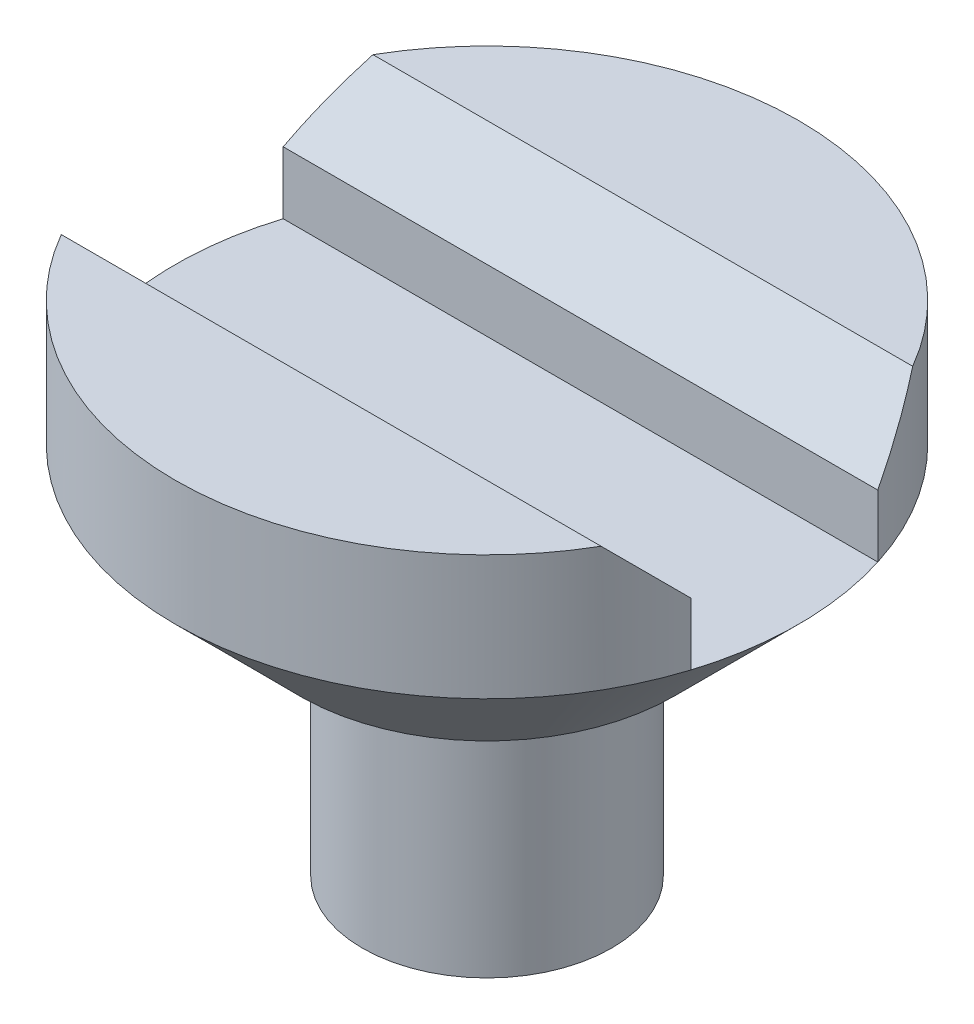
ISO-10303-21;
HEADER;
FILE_DESCRIPTION(('STEP AP214'),'2;1');
FILE_NAME('part.step','',(''),(''),'','','');
FILE_SCHEMA(('AUTOMOTIVE_DESIGN { 1 0 10303 214 1 1 1 1 }'));
ENDSEC;
DATA;
#1=APPLICATION_CONTEXT('core data for automotive mechanical design processes');
#2=APPLICATION_PROTOCOL_DEFINITION('international standard','automotive_design',2000,#1);
#3=PRODUCT_CONTEXT('',#1,'mechanical');
#4=PRODUCT('Part','Part','',(#3));
#5=PRODUCT_RELATED_PRODUCT_CATEGORY('part','',(#4));
#6=PRODUCT_DEFINITION_FORMATION('','',#4);
#7=PRODUCT_DEFINITION_CONTEXT('part definition',#1,'design');
#8=PRODUCT_DEFINITION('design','',#6,#7);
#9=PRODUCT_DEFINITION_SHAPE('','',#8);
#10=(LENGTH_UNIT() NAMED_UNIT(*) SI_UNIT(.MILLI.,.METRE.));
#11=(NAMED_UNIT(*) PLANE_ANGLE_UNIT() SI_UNIT($,.RADIAN.));
#12=(NAMED_UNIT(*) SI_UNIT($,.STERADIAN.) SOLID_ANGLE_UNIT());
#13=UNCERTAINTY_MEASURE_WITH_UNIT(LENGTH_MEASURE(1.E-05),#10,'distance_accuracy_value','');
#14=(GEOMETRIC_REPRESENTATION_CONTEXT(3) GLOBAL_UNCERTAINTY_ASSIGNED_CONTEXT((#13)) GLOBAL_UNIT_ASSIGNED_CONTEXT((#10,
#11,#12)) REPRESENTATION_CONTEXT('',''));
#15=CARTESIAN_POINT('',(0.,0.,0.));
#16=DIRECTION('',(0.,0.,1.));
#17=DIRECTION('',(1.,0.,0.));
#18=AXIS2_PLACEMENT_3D('',#15,#16,#17);
#19=CARTESIAN_POINT('',(0.,0.,0.));
#20=DIRECTION('',(0.,-1.,0.));
#21=DIRECTION('',(0.,0.,-1.));
#22=AXIS2_PLACEMENT_3D('',#19,#20,#21);
#23=CYLINDRICAL_SURFACE('',#22,63.5);
#24=DIRECTION('',(0.,-1.,0.));
#25=VECTOR('',#24,1.);
#26=CARTESIAN_POINT('',(-60.5751392899761,0.,19.05));
#27=LINE('',#26,#25);
#28=CARTESIAN_POINT('',(-60.5751392899761,76.2,19.05));
#29=VERTEX_POINT('',#28);
#30=CARTESIAN_POINT('',(-60.5751392899761,88.9,19.05));
#31=VERTEX_POINT('',#30);
#32=EDGE_CURVE('E140',#29,#31,#27,.F.);
#33=ORIENTED_EDGE('',*,*,#32,.F.);
#34=CARTESIAN_POINT('',(0.,76.2000000000001,0.));
#35=DIRECTION('',(0.,-1.,0.));
#36=DIRECTION('',(0.,0.,-1.));
#37=AXIS2_PLACEMENT_3D('',#34,#35,#36);
#38=CIRCLE('',#37,63.5);
#39=CARTESIAN_POINT('',(60.5751392899761,76.2,19.05));
#40=VERTEX_POINT('',#39);
#41=EDGE_CURVE('E11',#29,#40,#38,.F.);
#42=ORIENTED_EDGE('',*,*,#41,.T.);
#43=DIRECTION('',(0.,-1.,0.));
#44=VECTOR('',#43,1.);
#45=CARTESIAN_POINT('',(60.5751392899761,0.,19.05));
#46=LINE('',#45,#44);
#47=CARTESIAN_POINT('',(60.5751392899761,88.9,19.05));
#48=VERTEX_POINT('',#47);
#49=EDGE_CURVE('E98',#48,#40,#46,.T.);
#50=ORIENTED_EDGE('',*,*,#49,.F.);
#51=CARTESIAN_POINT('',(0.,69.8500000000001,0.));
#52=DIRECTION('',(0.,0.707106781186548,-0.707106781186547));
#53=DIRECTION('',(0.,-0.707106781186547,-0.707106781186548));
#54=AXIS2_PLACEMENT_3D('',#51,#52,#53);
#55=ELLIPSE('',#54,89.8025612106914,63.5);
#56=CARTESIAN_POINT('',(54.9926131403119,101.6,31.75));
#57=VERTEX_POINT('',#56);
#58=EDGE_CURVE('E134',#48,#57,#55,.F.);
#59=ORIENTED_EDGE('',*,*,#58,.T.);
#60=CARTESIAN_POINT('',(0.,101.6,0.));
#61=DIRECTION('',(0.,-1.,0.));
#62=DIRECTION('',(0.,0.,-1.));
#63=AXIS2_PLACEMENT_3D('',#60,#61,#62);
#64=CIRCLE('',#63,63.5);
#65=CARTESIAN_POINT('',(-54.9926131403118,101.6,31.75));
#66=VERTEX_POINT('',#65);
#67=EDGE_CURVE('E99',#57,#66,#64,.T.);
#68=ORIENTED_EDGE('',*,*,#67,.T.);
#69=CARTESIAN_POINT('',(0.,69.8500000000001,0.));
#70=DIRECTION('',(0.,0.707106781186548,-0.707106781186547));
#71=DIRECTION('',(0.,-0.707106781186547,-0.707106781186548));
#72=AXIS2_PLACEMENT_3D('',#69,#70,#71);
#73=ELLIPSE('',#72,89.8025612106914,63.5);
#74=EDGE_CURVE('E48',#66,#31,#73,.F.);
#75=ORIENTED_EDGE('',*,*,#74,.T.);
#76=EDGE_LOOP('',(#33,#42,#50,#59,#68,#75));
#77=FACE_BOUND('',#76,.T.);
#78=ADVANCED_FACE('F33',(#77),#23,.T.);
#79=CARTESIAN_POINT('',(0.,101.6,0.));
#80=DIRECTION('',(0.,1.,0.));
#81=DIRECTION('',(0.,0.,1.));
#82=AXIS2_PLACEMENT_3D('',#79,#80,#81);
#83=PLANE('',#82);
#84=CARTESIAN_POINT('',(-54.9926131403119,101.6,-31.75));
#85=VERTEX_POINT('',#84);
#86=CARTESIAN_POINT('',(54.9926131403119,101.6,-31.75));
#87=VERTEX_POINT('',#86);
#88=EDGE_CURVE('E145',#85,#87,#64,.T.);
#89=ORIENTED_EDGE('',*,*,#88,.F.);
#90=DIRECTION('',(1.,0.,0.));
#91=VECTOR('',#90,1.);
#92=CARTESIAN_POINT('',(60.5751392899761,101.6,-31.75));
#93=LINE('',#92,#91);
#94=EDGE_CURVE('E129',#85,#87,#93,.T.);
#95=ORIENTED_EDGE('',*,*,#94,.T.);
#96=EDGE_LOOP('',(#89,#95));
#97=FACE_BOUND('',#96,.T.);
#98=ADVANCED_FACE('F170',(#97),#83,.T.);
#99=CARTESIAN_POINT('',(25.4,0.,0.));
#100=DIRECTION('',(0.,-1.,0.));
#101=DIRECTION('',(0.,0.,-1.));
#102=AXIS2_PLACEMENT_3D('',#99,#100,#101);
#103=PLANE('',#102);
#104=CARTESIAN_POINT('',(0.,0.,0.));
#105=DIRECTION('',(0.,-1.,0.));
#106=DIRECTION('',(0.,0.,-1.));
#107=AXIS2_PLACEMENT_3D('',#104,#105,#106);
#108=CIRCLE('',#107,25.4);
#109=CARTESIAN_POINT('',(0.,0.,-25.4));
#110=VERTEX_POINT('',#109);
#111=EDGE_CURVE('E112',#110,#110,#108,.T.);
#112=ORIENTED_EDGE('',*,*,#111,.T.);
#113=EDGE_LOOP('',(#112));
#114=FACE_BOUND('',#113,.T.);
#115=ADVANCED_FACE('F153',(#114),#103,.T.);
#116=ORIENTED_EDGE('',*,*,#67,.F.);
#117=DIRECTION('',(-1.,0.,0.));
#118=VECTOR('',#117,1.);
#119=CARTESIAN_POINT('',(-60.5751392899761,101.6,31.75));
#120=LINE('',#119,#118);
#121=EDGE_CURVE('E55',#57,#66,#120,.T.);
#122=ORIENTED_EDGE('',*,*,#121,.T.);
#123=EDGE_LOOP('',(#116,#122));
#124=FACE_BOUND('',#123,.T.);
#125=ADVANCED_FACE('F177',(#124),#83,.T.);
#126=DIRECTION('',(0.,-1.,0.));
#127=VECTOR('',#126,1.);
#128=CARTESIAN_POINT('',(60.5751392899761,0.,-19.05));
#129=LINE('',#128,#127);
#130=CARTESIAN_POINT('',(60.5751392899761,76.2,-19.05));
#131=VERTEX_POINT('',#130);
#132=CARTESIAN_POINT('',(60.5751392899761,88.9,-19.05));
#133=VERTEX_POINT('',#132);
#134=EDGE_CURVE('E108',#131,#133,#129,.F.);
#135=ORIENTED_EDGE('',*,*,#134,.F.);
#136=CARTESIAN_POINT('',(0.,76.2000000000001,0.));
#137=DIRECTION('',(0.,-1.,0.));
#138=DIRECTION('',(0.,0.,-1.));
#139=AXIS2_PLACEMENT_3D('',#136,#137,#138);
#140=CIRCLE('',#139,63.5);
#141=CARTESIAN_POINT('',(-60.5751392899761,76.2,-19.05));
#142=VERTEX_POINT('',#141);
#143=EDGE_CURVE('E41',#131,#142,#140,.F.);
#144=ORIENTED_EDGE('',*,*,#143,.T.);
#145=DIRECTION('',(0.,-1.,0.));
#146=VECTOR('',#145,1.);
#147=CARTESIAN_POINT('',(-60.5751392899761,0.,-19.05));
#148=LINE('',#147,#146);
#149=CARTESIAN_POINT('',(-60.5751392899761,88.9,-19.05));
#150=VERTEX_POINT('',#149);
#151=EDGE_CURVE('E111',#150,#142,#148,.T.);
#152=ORIENTED_EDGE('',*,*,#151,.F.);
#153=CARTESIAN_POINT('',(0.,69.8500000000001,0.));
#154=DIRECTION('',(0.,0.707106781186548,0.707106781186547));
#155=DIRECTION('',(0.,-0.707106781186547,0.707106781186548));
#156=AXIS2_PLACEMENT_3D('',#153,#154,#155);
#157=ELLIPSE('',#156,89.8025612106914,63.5);
#158=EDGE_CURVE('E131',#150,#85,#157,.F.);
#159=ORIENTED_EDGE('',*,*,#158,.T.);
#160=ORIENTED_EDGE('',*,*,#88,.T.);
#161=CARTESIAN_POINT('',(0.,69.8500000000001,0.));
#162=DIRECTION('',(0.,0.707106781186548,0.707106781186547));
#163=DIRECTION('',(0.,-0.707106781186547,0.707106781186548));
#164=AXIS2_PLACEMENT_3D('',#161,#162,#163);
#165=ELLIPSE('',#164,89.8025612106914,63.5);
#166=EDGE_CURVE('E118',#87,#133,#165,.F.);
#167=ORIENTED_EDGE('',*,*,#166,.T.);
#168=EDGE_LOOP('',(#135,#144,#152,#159,#160,#167));
#169=FACE_BOUND('',#168,.T.);
#170=ADVANCED_FACE('F115',(#169),#23,.T.);
#171=CARTESIAN_POINT('',(63.5,50.8,0.));
#172=DIRECTION('',(0.,-1.,0.));
#173=DIRECTION('',(0.,0.,-1.));
#174=AXIS2_PLACEMENT_3D('',#171,#172,#173);
#175=PLANE('',#174);
#176=CARTESIAN_POINT('',(0.,50.8,0.));
#177=DIRECTION('',(0.,-1.,0.));
#178=DIRECTION('',(0.,0.,-1.));
#179=AXIS2_PLACEMENT_3D('',#176,#177,#178);
#180=CIRCLE('',#179,38.0999999999999);
#181=CARTESIAN_POINT('',(0.,50.8,-38.0999999999999));
#182=VERTEX_POINT('',#181);
#183=EDGE_CURVE('E121',#182,#182,#180,.T.);
#184=ORIENTED_EDGE('',*,*,#183,.T.);
#185=EDGE_LOOP('',(#184));
#186=FACE_BOUND('',#185,.T.);
#187=CARTESIAN_POINT('',(0.,50.8,0.));
#188=DIRECTION('',(0.,-1.,0.));
#189=DIRECTION('',(0.,0.,-1.));
#190=AXIS2_PLACEMENT_3D('',#187,#188,#189);
#191=CIRCLE('',#190,25.4);
#192=CARTESIAN_POINT('',(0.,50.8,-25.4));
#193=VERTEX_POINT('',#192);
#194=EDGE_CURVE('E146',#193,#193,#191,.T.);
#195=ORIENTED_EDGE('',*,*,#194,.F.);
#196=EDGE_LOOP('',(#195));
#197=FACE_BOUND('',#196,.T.);
#198=ADVANCED_FACE('F157',(#186,#197),#175,.T.);
#199=CARTESIAN_POINT('',(0.,0.,0.));
#200=DIRECTION('',(0.,-1.,0.));
#201=DIRECTION('',(0.,0.,-1.));
#202=AXIS2_PLACEMENT_3D('',#199,#200,#201);
#203=CYLINDRICAL_SURFACE('',#202,25.4);
#204=ORIENTED_EDGE('',*,*,#194,.T.);
#205=EDGE_LOOP('',(#204));
#206=FACE_BOUND('',#205,.T.);
#207=ORIENTED_EDGE('',*,*,#111,.F.);
#208=EDGE_LOOP('',(#207));
#209=FACE_BOUND('',#208,.T.);
#210=ADVANCED_FACE('F155',(#206,#209),#203,.T.);
#211=CARTESIAN_POINT('',(88.9,76.2,-19.05));
#212=DIRECTION('',(0.,0.,-1.));
#213=DIRECTION('',(-1.,0.,0.));
#214=AXIS2_PLACEMENT_3D('',#211,#212,#213);
#215=PLANE('',#214);
#216=ORIENTED_EDGE('',*,*,#134,.T.);
#217=DIRECTION('',(-1.,0.,0.));
#218=VECTOR('',#217,1.);
#219=CARTESIAN_POINT('',(-60.5751392899761,88.9,-19.05));
#220=LINE('',#219,#218);
#221=EDGE_CURVE('E137',#133,#150,#220,.T.);
#222=ORIENTED_EDGE('',*,*,#221,.T.);
#223=ORIENTED_EDGE('',*,*,#151,.T.);
#224=DIRECTION('',(-1.,0.,0.));
#225=VECTOR('',#224,1.);
#226=CARTESIAN_POINT('',(88.9,76.2,-19.05));
#227=LINE('',#226,#225);
#228=EDGE_CURVE('E92',#131,#142,#227,.T.);
#229=ORIENTED_EDGE('',*,*,#228,.F.);
#230=EDGE_LOOP('',(#216,#222,#223,#229));
#231=FACE_BOUND('',#230,.T.);
#232=ADVANCED_FACE('F106',(#231),#215,.F.);
#233=CARTESIAN_POINT('',(88.9,76.2,19.05));
#234=DIRECTION('',(0.,0.,1.));
#235=DIRECTION('',(1.,0.,0.));
#236=AXIS2_PLACEMENT_3D('',#233,#234,#235);
#237=PLANE('',#236);
#238=ORIENTED_EDGE('',*,*,#32,.T.);
#239=DIRECTION('',(1.,0.,0.));
#240=VECTOR('',#239,1.);
#241=CARTESIAN_POINT('',(60.5751392899761,88.9,19.05));
#242=LINE('',#241,#240);
#243=EDGE_CURVE('E126',#31,#48,#242,.T.);
#244=ORIENTED_EDGE('',*,*,#243,.T.);
#245=ORIENTED_EDGE('',*,*,#49,.T.);
#246=DIRECTION('',(1.,0.,0.));
#247=VECTOR('',#246,1.);
#248=CARTESIAN_POINT('',(88.9,76.2,19.05));
#249=LINE('',#248,#247);
#250=EDGE_CURVE('E95',#29,#40,#249,.T.);
#251=ORIENTED_EDGE('',*,*,#250,.F.);
#252=EDGE_LOOP('',(#238,#244,#245,#251));
#253=FACE_BOUND('',#252,.T.);
#254=ADVANCED_FACE('F164',(#253),#237,.F.);
#255=CARTESIAN_POINT('',(0.,76.2,0.));
#256=DIRECTION('',(0.,1.,0.));
#257=DIRECTION('',(0.,0.,1.));
#258=AXIS2_PLACEMENT_3D('',#255,#256,#257);
#259=PLANE('',#258);
#260=ORIENTED_EDGE('',*,*,#250,.T.);
#261=CARTESIAN_POINT('',(0.,76.2,0.));
#262=DIRECTION('',(0.,1.,0.));
#263=DIRECTION('',(0.,0.,1.));
#264=AXIS2_PLACEMENT_3D('',#261,#262,#263);
#265=CIRCLE('',#264,63.5);
#266=EDGE_CURVE('E88',#131,#40,#265,.F.);
#267=ORIENTED_EDGE('',*,*,#266,.F.);
#268=ORIENTED_EDGE('',*,*,#228,.T.);
#269=EDGE_CURVE('E101',#29,#142,#265,.F.);
#270=ORIENTED_EDGE('',*,*,#269,.F.);
#271=EDGE_LOOP('',(#260,#267,#268,#270));
#272=FACE_BOUND('',#271,.T.);
#273=ADVANCED_FACE('F90',(#272),#259,.T.);
#274=CARTESIAN_POINT('',(88.9,88.9,-19.05));
#275=DIRECTION('',(0.,0.707106781186548,0.707106781186547));
#276=DIRECTION('',(1.,0.,0.));
#277=AXIS2_PLACEMENT_3D('',#274,#275,#276);
#278=PLANE('',#277);
#279=ORIENTED_EDGE('',*,*,#166,.F.);
#280=ORIENTED_EDGE('',*,*,#94,.F.);
#281=ORIENTED_EDGE('',*,*,#158,.F.);
#282=ORIENTED_EDGE('',*,*,#221,.F.);
#283=EDGE_LOOP('',(#279,#280,#281,#282));
#284=FACE_BOUND('',#283,.T.);
#285=ADVANCED_FACE('F187',(#284),#278,.T.);
#286=CARTESIAN_POINT('',(88.9,88.9,19.05));
#287=DIRECTION('',(0.,0.707106781186548,-0.707106781186547));
#288=DIRECTION('',(-1.,0.,0.));
#289=AXIS2_PLACEMENT_3D('',#286,#287,#288);
#290=PLANE('',#289);
#291=ORIENTED_EDGE('',*,*,#74,.F.);
#292=ORIENTED_EDGE('',*,*,#121,.F.);
#293=ORIENTED_EDGE('',*,*,#58,.F.);
#294=ORIENTED_EDGE('',*,*,#243,.F.);
#295=EDGE_LOOP('',(#291,#292,#293,#294));
#296=FACE_BOUND('',#295,.T.);
#297=ADVANCED_FACE('F189',(#296),#290,.T.);
#298=CARTESIAN_POINT('',(0.,50.8,0.));
#299=DIRECTION('',(0.,1.,0.));
#300=DIRECTION('',(0.,0.,1.));
#301=AXIS2_PLACEMENT_3D('',#298,#299,#300);
#302=CONICAL_SURFACE('',#301,38.0999999999999,0.785398163397447);
#303=ORIENTED_EDGE('',*,*,#41,.F.);
#304=ORIENTED_EDGE('',*,*,#269,.T.);
#305=ORIENTED_EDGE('',*,*,#143,.F.);
#306=ORIENTED_EDGE('',*,*,#266,.T.);
#307=EDGE_LOOP('',(#303,#304,#305,#306));
#308=FACE_BOUND('',#307,.T.);
#309=ORIENTED_EDGE('',*,*,#183,.F.);
#310=EDGE_LOOP('',(#309));
#311=FACE_BOUND('',#310,.T.);
#312=ADVANCED_FACE('F35',(#308,#311),#302,.T.);
#313=CLOSED_SHELL('',(#78,#98,#115,#125,#170,#198,#210,#232,#254,#273,#285,#297,#312));
#314=MANIFOLD_SOLID_BREP('B2',#313);
#315=ADVANCED_BREP_SHAPE_REPRESENTATION('',(#18,#314),#14);
#316=SHAPE_DEFINITION_REPRESENTATION(#9,#315);
ENDSEC;
END-ISO-10303-21;
